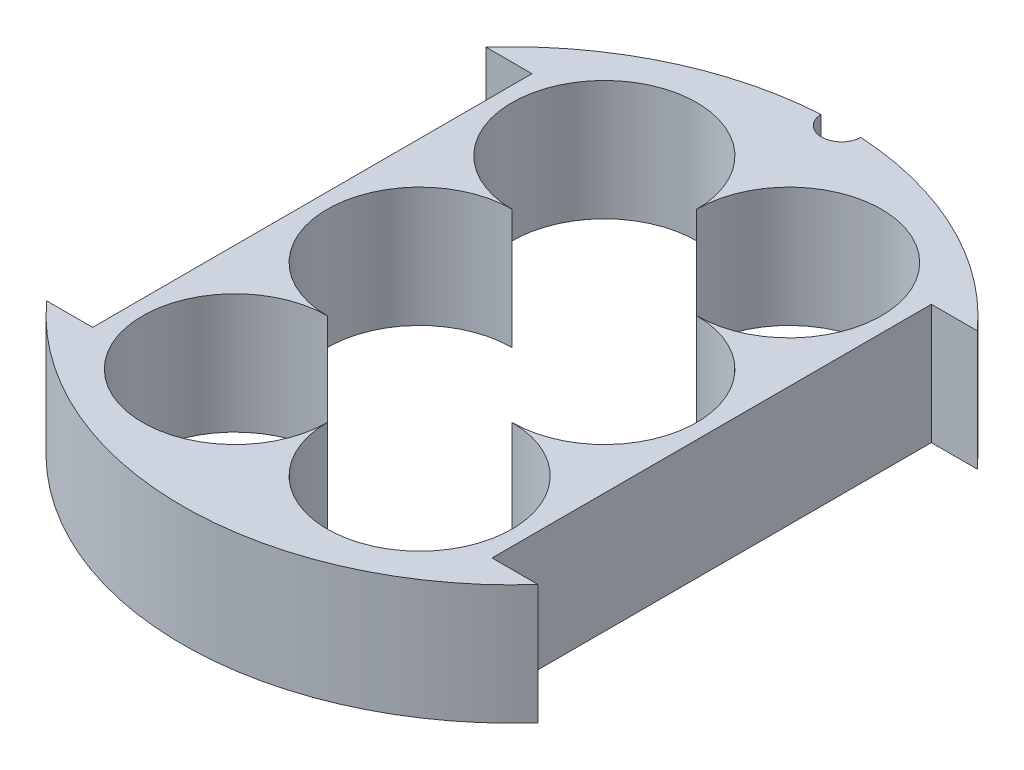
ISO-10303-21;
HEADER;
FILE_DESCRIPTION(('STEP AP214'),'2;1');
FILE_NAME('part.step','',(''),(''),'','','');
FILE_SCHEMA(('AUTOMOTIVE_DESIGN { 1 0 10303 214 1 1 1 1 }'));
ENDSEC;
DATA;
#1=APPLICATION_CONTEXT('core data for automotive mechanical design processes');
#2=APPLICATION_PROTOCOL_DEFINITION('international standard','automotive_design',2000,#1);
#3=PRODUCT_CONTEXT('',#1,'mechanical');
#4=PRODUCT('Part','Part','',(#3));
#5=PRODUCT_RELATED_PRODUCT_CATEGORY('part','',(#4));
#6=PRODUCT_DEFINITION_FORMATION('','',#4);
#7=PRODUCT_DEFINITION_CONTEXT('part definition',#1,'design');
#8=PRODUCT_DEFINITION('design','',#6,#7);
#9=PRODUCT_DEFINITION_SHAPE('','',#8);
#10=(LENGTH_UNIT() NAMED_UNIT(*) SI_UNIT(.MILLI.,.METRE.));
#11=(NAMED_UNIT(*) PLANE_ANGLE_UNIT() SI_UNIT($,.RADIAN.));
#12=(NAMED_UNIT(*) SI_UNIT($,.STERADIAN.) SOLID_ANGLE_UNIT());
#13=UNCERTAINTY_MEASURE_WITH_UNIT(LENGTH_MEASURE(1.E-05),#10,'distance_accuracy_value','');
#14=(GEOMETRIC_REPRESENTATION_CONTEXT(3) GLOBAL_UNCERTAINTY_ASSIGNED_CONTEXT((#13)) GLOBAL_UNIT_ASSIGNED_CONTEXT((#10,
#11,#12)) REPRESENTATION_CONTEXT('',''));
#15=CARTESIAN_POINT('',(0.,0.,0.));
#16=DIRECTION('',(0.,0.,1.));
#17=DIRECTION('',(1.,0.,0.));
#18=AXIS2_PLACEMENT_3D('',#15,#16,#17);
#19=CARTESIAN_POINT('',(9.25,12.,-18.5));
#20=DIRECTION('',(0.,-1.,0.));
#21=DIRECTION('',(0.,0.,-1.));
#22=AXIS2_PLACEMENT_3D('',#19,#20,#21);
#23=CYLINDRICAL_SURFACE('',#22,9.25);
#24=CARTESIAN_POINT('',(9.25,0.,-18.5));
#25=DIRECTION('',(0.,1.,0.));
#26=DIRECTION('',(0.,0.,1.));
#27=AXIS2_PLACEMENT_3D('',#24,#25,#26);
#28=CIRCLE('',#27,9.25);
#29=CARTESIAN_POINT('',(9.25,0.,-9.25));
#30=VERTEX_POINT('',#29);
#31=CARTESIAN_POINT('',(0.,0.,-18.5));
#32=VERTEX_POINT('',#31);
#33=EDGE_CURVE('E214',#30,#32,#28,.T.);
#34=ORIENTED_EDGE('',*,*,#33,.F.);
#35=DIRECTION('',(0.,-1.,0.));
#36=VECTOR('',#35,1.);
#37=CARTESIAN_POINT('',(9.25,12.,-9.25));
#38=LINE('',#37,#36);
#39=CARTESIAN_POINT('',(9.25,12.,-9.25));
#40=VERTEX_POINT('',#39);
#41=EDGE_CURVE('E11',#40,#30,#38,.T.);
#42=ORIENTED_EDGE('',*,*,#41,.F.);
#43=CARTESIAN_POINT('',(9.25,12.,-18.5));
#44=DIRECTION('',(0.,1.,0.));
#45=DIRECTION('',(0.,0.,1.));
#46=AXIS2_PLACEMENT_3D('',#43,#44,#45);
#47=CIRCLE('',#46,9.25);
#48=CARTESIAN_POINT('',(0.,12.,-18.5));
#49=VERTEX_POINT('',#48);
#50=EDGE_CURVE('E462',#40,#49,#47,.T.);
#51=ORIENTED_EDGE('',*,*,#50,.T.);
#52=DIRECTION('',(0.,-1.,0.));
#53=VECTOR('',#52,1.);
#54=CARTESIAN_POINT('',(0.,12.,-18.5));
#55=LINE('',#54,#53);
#56=EDGE_CURVE('E58',#49,#32,#55,.T.);
#57=ORIENTED_EDGE('',*,*,#56,.T.);
#58=EDGE_LOOP('',(#34,#42,#51,#57));
#59=FACE_BOUND('',#58,.T.);
#60=ADVANCED_FACE('F39',(#59),#23,.F.);
#61=CARTESIAN_POINT('',(9.25,12.,0.));
#62=DIRECTION('',(0.,-1.,0.));
#63=DIRECTION('',(0.,0.,-1.));
#64=AXIS2_PLACEMENT_3D('',#61,#62,#63);
#65=CYLINDRICAL_SURFACE('',#64,9.25);
#66=CARTESIAN_POINT('',(9.25,0.,0.));
#67=DIRECTION('',(0.,1.,0.));
#68=DIRECTION('',(0.,0.,1.));
#69=AXIS2_PLACEMENT_3D('',#66,#67,#68);
#70=CIRCLE('',#69,9.25);
#71=CARTESIAN_POINT('',(9.25,0.,9.25));
#72=VERTEX_POINT('',#71);
#73=EDGE_CURVE('E216',#72,#30,#70,.T.);
#74=ORIENTED_EDGE('',*,*,#73,.F.);
#75=DIRECTION('',(0.,-1.,0.));
#76=VECTOR('',#75,1.);
#77=CARTESIAN_POINT('',(9.25,12.,9.25));
#78=LINE('',#77,#76);
#79=CARTESIAN_POINT('',(9.25,12.,9.25));
#80=VERTEX_POINT('',#79);
#81=EDGE_CURVE('E49',#80,#72,#78,.T.);
#82=ORIENTED_EDGE('',*,*,#81,.F.);
#83=CARTESIAN_POINT('',(9.25,12.,0.));
#84=DIRECTION('',(0.,1.,0.));
#85=DIRECTION('',(0.,0.,1.));
#86=AXIS2_PLACEMENT_3D('',#83,#84,#85);
#87=CIRCLE('',#86,9.25);
#88=EDGE_CURVE('E464',#80,#40,#87,.T.);
#89=ORIENTED_EDGE('',*,*,#88,.T.);
#90=ORIENTED_EDGE('',*,*,#41,.T.);
#91=EDGE_LOOP('',(#74,#82,#89,#90));
#92=FACE_BOUND('',#91,.T.);
#93=ADVANCED_FACE('F314',(#92),#65,.F.);
#94=CARTESIAN_POINT('',(9.25,12.,18.5));
#95=DIRECTION('',(0.,-1.,0.));
#96=DIRECTION('',(0.,0.,-1.));
#97=AXIS2_PLACEMENT_3D('',#94,#95,#96);
#98=CYLINDRICAL_SURFACE('',#97,9.25);
#99=CARTESIAN_POINT('',(9.25,0.,18.5));
#100=DIRECTION('',(0.,1.,0.));
#101=DIRECTION('',(0.,0.,1.));
#102=AXIS2_PLACEMENT_3D('',#99,#100,#101);
#103=CIRCLE('',#102,9.25);
#104=CARTESIAN_POINT('',(0.,0.,18.5));
#105=VERTEX_POINT('',#104);
#106=EDGE_CURVE('E219',#105,#72,#103,.T.);
#107=ORIENTED_EDGE('',*,*,#106,.F.);
#108=DIRECTION('',(0.,-1.,0.));
#109=VECTOR('',#108,1.);
#110=CARTESIAN_POINT('',(0.,12.,18.5));
#111=LINE('',#110,#109);
#112=CARTESIAN_POINT('',(0.,12.,18.5));
#113=VERTEX_POINT('',#112);
#114=EDGE_CURVE('E169',#113,#105,#111,.T.);
#115=ORIENTED_EDGE('',*,*,#114,.F.);
#116=CARTESIAN_POINT('',(9.25,12.,18.5));
#117=DIRECTION('',(0.,1.,0.));
#118=DIRECTION('',(0.,0.,1.));
#119=AXIS2_PLACEMENT_3D('',#116,#117,#118);
#120=CIRCLE('',#119,9.25);
#121=EDGE_CURVE('E180',#113,#80,#120,.T.);
#122=ORIENTED_EDGE('',*,*,#121,.T.);
#123=ORIENTED_EDGE('',*,*,#81,.T.);
#124=EDGE_LOOP('',(#107,#115,#122,#123));
#125=FACE_BOUND('',#124,.T.);
#126=ADVANCED_FACE('F319',(#125),#98,.F.);
#127=CARTESIAN_POINT('',(-9.25,12.,18.5));
#128=DIRECTION('',(0.,-1.,0.));
#129=DIRECTION('',(0.,0.,-1.));
#130=AXIS2_PLACEMENT_3D('',#127,#128,#129);
#131=CYLINDRICAL_SURFACE('',#130,9.25);
#132=CARTESIAN_POINT('',(-9.25,0.,18.5));
#133=DIRECTION('',(0.,1.,0.));
#134=DIRECTION('',(0.,0.,1.));
#135=AXIS2_PLACEMENT_3D('',#132,#133,#134);
#136=CIRCLE('',#135,9.25);
#137=CARTESIAN_POINT('',(-9.25,0.,9.25));
#138=VERTEX_POINT('',#137);
#139=EDGE_CURVE('E165',#138,#105,#136,.T.);
#140=ORIENTED_EDGE('',*,*,#139,.F.);
#141=DIRECTION('',(0.,-1.,0.));
#142=VECTOR('',#141,1.);
#143=CARTESIAN_POINT('',(-9.25,12.,9.25));
#144=LINE('',#143,#142);
#145=CARTESIAN_POINT('',(-9.25,12.,9.25));
#146=VERTEX_POINT('',#145);
#147=EDGE_CURVE('E160',#146,#138,#144,.T.);
#148=ORIENTED_EDGE('',*,*,#147,.F.);
#149=CARTESIAN_POINT('',(-9.25,12.,18.5));
#150=DIRECTION('',(0.,1.,0.));
#151=DIRECTION('',(0.,0.,1.));
#152=AXIS2_PLACEMENT_3D('',#149,#150,#151);
#153=CIRCLE('',#152,9.25);
#154=EDGE_CURVE('E163',#146,#113,#153,.T.);
#155=ORIENTED_EDGE('',*,*,#154,.T.);
#156=ORIENTED_EDGE('',*,*,#114,.T.);
#157=EDGE_LOOP('',(#140,#148,#155,#156));
#158=FACE_BOUND('',#157,.T.);
#159=ADVANCED_FACE('F162',(#158),#131,.F.);
#160=CARTESIAN_POINT('',(-9.25,12.,0.));
#161=DIRECTION('',(0.,-1.,0.));
#162=DIRECTION('',(0.,0.,-1.));
#163=AXIS2_PLACEMENT_3D('',#160,#161,#162);
#164=CYLINDRICAL_SURFACE('',#163,9.25);
#165=CARTESIAN_POINT('',(-9.25,0.,0.));
#166=DIRECTION('',(0.,1.,0.));
#167=DIRECTION('',(0.,0.,1.));
#168=AXIS2_PLACEMENT_3D('',#165,#166,#167);
#169=CIRCLE('',#168,9.25);
#170=CARTESIAN_POINT('',(-9.25,0.,-9.25));
#171=VERTEX_POINT('',#170);
#172=EDGE_CURVE('E223',#171,#138,#169,.T.);
#173=ORIENTED_EDGE('',*,*,#172,.F.);
#174=DIRECTION('',(0.,-1.,0.));
#175=VECTOR('',#174,1.);
#176=CARTESIAN_POINT('',(-9.25,12.,-9.25));
#177=LINE('',#176,#175);
#178=CARTESIAN_POINT('',(-9.25,12.,-9.25));
#179=VERTEX_POINT('',#178);
#180=EDGE_CURVE('E107',#179,#171,#177,.T.);
#181=ORIENTED_EDGE('',*,*,#180,.F.);
#182=CARTESIAN_POINT('',(-9.25,12.,0.));
#183=DIRECTION('',(0.,1.,0.));
#184=DIRECTION('',(0.,0.,1.));
#185=AXIS2_PLACEMENT_3D('',#182,#183,#184);
#186=CIRCLE('',#185,9.25);
#187=EDGE_CURVE('E177',#179,#146,#186,.T.);
#188=ORIENTED_EDGE('',*,*,#187,.T.);
#189=ORIENTED_EDGE('',*,*,#147,.T.);
#190=EDGE_LOOP('',(#173,#181,#188,#189));
#191=FACE_BOUND('',#190,.T.);
#192=ADVANCED_FACE('F182',(#191),#164,.F.);
#193=CARTESIAN_POINT('',(20.,12.,0.));
#194=DIRECTION('',(-1.,0.,0.));
#195=DIRECTION('',(0.,0.,1.));
#196=AXIS2_PLACEMENT_3D('',#193,#194,#195);
#197=PLANE('',#196);
#198=DIRECTION('',(0.,0.,-1.));
#199=VECTOR('',#198,1.);
#200=CARTESIAN_POINT('',(20.,0.,0.));
#201=LINE('',#200,#199);
#202=CARTESIAN_POINT('',(20.,0.,22.));
#203=VERTEX_POINT('',#202);
#204=CARTESIAN_POINT('',(20.,0.,-22.));
#205=VERTEX_POINT('',#204);
#206=EDGE_CURVE('E189',#203,#205,#201,.T.);
#207=ORIENTED_EDGE('',*,*,#206,.T.);
#208=DIRECTION('',(0.,-1.,0.));
#209=VECTOR('',#208,1.);
#210=CARTESIAN_POINT('',(20.,12.,-22.));
#211=LINE('',#210,#209);
#212=CARTESIAN_POINT('',(20.,12.,-22.));
#213=VERTEX_POINT('',#212);
#214=EDGE_CURVE('E43',#213,#205,#211,.T.);
#215=ORIENTED_EDGE('',*,*,#214,.F.);
#216=DIRECTION('',(0.,0.,-1.));
#217=VECTOR('',#216,1.);
#218=CARTESIAN_POINT('',(20.,12.,0.));
#219=LINE('',#218,#217);
#220=CARTESIAN_POINT('',(20.,12.,22.));
#221=VERTEX_POINT('',#220);
#222=EDGE_CURVE('E228',#221,#213,#219,.T.);
#223=ORIENTED_EDGE('',*,*,#222,.F.);
#224=DIRECTION('',(0.,-1.,0.));
#225=VECTOR('',#224,1.);
#226=CARTESIAN_POINT('',(20.,12.,22.));
#227=LINE('',#226,#225);
#228=EDGE_CURVE('E185',#221,#203,#227,.T.);
#229=ORIENTED_EDGE('',*,*,#228,.T.);
#230=EDGE_LOOP('',(#207,#215,#223,#229));
#231=FACE_BOUND('',#230,.T.);
#232=ADVANCED_FACE('F41',(#231),#197,.F.);
#233=CARTESIAN_POINT('',(0.,12.,-22.));
#234=DIRECTION('',(0.,0.,-1.));
#235=DIRECTION('',(-1.,0.,0.));
#236=AXIS2_PLACEMENT_3D('',#233,#234,#235);
#237=PLANE('',#236);
#238=DIRECTION('',(1.,0.,0.));
#239=VECTOR('',#238,1.);
#240=CARTESIAN_POINT('',(0.,0.,-22.));
#241=LINE('',#240,#239);
#242=CARTESIAN_POINT('',(24.5967477524977,0.,-22.));
#243=VERTEX_POINT('',#242);
#244=EDGE_CURVE('E192',#205,#243,#241,.T.);
#245=ORIENTED_EDGE('',*,*,#244,.T.);
#246=DIRECTION('',(0.,-1.,0.));
#247=VECTOR('',#246,1.);
#248=CARTESIAN_POINT('',(24.5967477524977,12.,-22.));
#249=LINE('',#248,#247);
#250=CARTESIAN_POINT('',(24.5967477524977,12.,-22.));
#251=VERTEX_POINT('',#250);
#252=EDGE_CURVE('E251',#251,#243,#249,.T.);
#253=ORIENTED_EDGE('',*,*,#252,.F.);
#254=DIRECTION('',(1.,0.,0.));
#255=VECTOR('',#254,1.);
#256=CARTESIAN_POINT('',(0.,12.,-22.));
#257=LINE('',#256,#255);
#258=EDGE_CURVE('E120',#213,#251,#257,.T.);
#259=ORIENTED_EDGE('',*,*,#258,.F.);
#260=ORIENTED_EDGE('',*,*,#214,.T.);
#261=EDGE_LOOP('',(#245,#253,#259,#260));
#262=FACE_BOUND('',#261,.T.);
#263=ADVANCED_FACE('F257',(#262),#237,.F.);
#264=CARTESIAN_POINT('',(0.,12.,0.));
#265=DIRECTION('',(0.,-1.,0.));
#266=DIRECTION('',(0.,0.,-1.));
#267=AXIS2_PLACEMENT_3D('',#264,#265,#266);
#268=CYLINDRICAL_SURFACE('',#267,33.);
#269=CARTESIAN_POINT('',(0.,0.,0.));
#270=DIRECTION('',(0.,1.,0.));
#271=DIRECTION('',(0.,0.,1.));
#272=AXIS2_PLACEMENT_3D('',#269,#270,#271);
#273=CIRCLE('',#272,33.);
#274=CARTESIAN_POINT('',(1.99908151545108,0.,-32.9393939393939));
#275=VERTEX_POINT('',#274);
#276=EDGE_CURVE('E194',#243,#275,#273,.T.);
#277=ORIENTED_EDGE('',*,*,#276,.T.);
#278=DIRECTION('',(0.,-1.,0.));
#279=VECTOR('',#278,1.);
#280=CARTESIAN_POINT('',(1.99908151545108,12.,-32.9393939393939));
#281=LINE('',#280,#279);
#282=CARTESIAN_POINT('',(1.99908151545108,12.,-32.9393939393939));
#283=VERTEX_POINT('',#282);
#284=EDGE_CURVE('E250',#283,#275,#281,.T.);
#285=ORIENTED_EDGE('',*,*,#284,.F.);
#286=CARTESIAN_POINT('',(0.,12.,0.));
#287=DIRECTION('',(0.,1.,0.));
#288=DIRECTION('',(0.,0.,1.));
#289=AXIS2_PLACEMENT_3D('',#286,#287,#288);
#290=CIRCLE('',#289,33.);
#291=EDGE_CURVE('E477',#251,#283,#290,.T.);
#292=ORIENTED_EDGE('',*,*,#291,.F.);
#293=ORIENTED_EDGE('',*,*,#252,.T.);
#294=EDGE_LOOP('',(#277,#285,#292,#293));
#295=FACE_BOUND('',#294,.T.);
#296=ADVANCED_FACE('F304',(#295),#268,.T.);
#297=CARTESIAN_POINT('',(0.,12.,-33.));
#298=DIRECTION('',(0.,-1.,0.));
#299=DIRECTION('',(0.,0.,-1.));
#300=AXIS2_PLACEMENT_3D('',#297,#298,#299);
#301=CYLINDRICAL_SURFACE('',#300,2.00000000000008);
#302=CARTESIAN_POINT('',(0.,0.,-33.));
#303=DIRECTION('',(0.,1.,0.));
#304=DIRECTION('',(0.,0.,1.));
#305=AXIS2_PLACEMENT_3D('',#302,#303,#304);
#306=CIRCLE('',#305,2.00000000000008);
#307=CARTESIAN_POINT('',(-1.99908151545106,0.,-32.9393939393939));
#308=VERTEX_POINT('',#307);
#309=EDGE_CURVE('E197',#308,#275,#306,.T.);
#310=ORIENTED_EDGE('',*,*,#309,.F.);
#311=DIRECTION('',(0.,-1.,0.));
#312=VECTOR('',#311,1.);
#313=CARTESIAN_POINT('',(-1.99908151545106,12.,-32.9393939393939));
#314=LINE('',#313,#312);
#315=CARTESIAN_POINT('',(-1.99908151545106,12.,-32.9393939393939));
#316=VERTEX_POINT('',#315);
#317=EDGE_CURVE('E248',#316,#308,#314,.T.);
#318=ORIENTED_EDGE('',*,*,#317,.F.);
#319=CARTESIAN_POINT('',(0.,12.,-33.));
#320=DIRECTION('',(0.,1.,0.));
#321=DIRECTION('',(0.,0.,1.));
#322=AXIS2_PLACEMENT_3D('',#319,#320,#321);
#323=CIRCLE('',#322,2.00000000000008);
#324=EDGE_CURVE('E303',#316,#283,#323,.T.);
#325=ORIENTED_EDGE('',*,*,#324,.T.);
#326=ORIENTED_EDGE('',*,*,#284,.T.);
#327=EDGE_LOOP('',(#310,#318,#325,#326));
#328=FACE_BOUND('',#327,.T.);
#329=ADVANCED_FACE('F298',(#328),#301,.F.);
#330=CARTESIAN_POINT('',(0.,12.,0.));
#331=DIRECTION('',(0.,-1.,0.));
#332=DIRECTION('',(0.,0.,-1.));
#333=AXIS2_PLACEMENT_3D('',#330,#331,#332);
#334=CYLINDRICAL_SURFACE('',#333,33.);
#335=CARTESIAN_POINT('',(0.,0.,0.));
#336=DIRECTION('',(0.,1.,0.));
#337=DIRECTION('',(0.,0.,1.));
#338=AXIS2_PLACEMENT_3D('',#335,#336,#337);
#339=CIRCLE('',#338,33.);
#340=CARTESIAN_POINT('',(-24.5967477524977,0.,-22.));
#341=VERTEX_POINT('',#340);
#342=EDGE_CURVE('E200',#308,#341,#339,.T.);
#343=ORIENTED_EDGE('',*,*,#342,.T.);
#344=DIRECTION('',(0.,-1.,0.));
#345=VECTOR('',#344,1.);
#346=CARTESIAN_POINT('',(-24.5967477524977,12.,-22.));
#347=LINE('',#346,#345);
#348=CARTESIAN_POINT('',(-24.5967477524977,12.,-22.));
#349=VERTEX_POINT('',#348);
#350=EDGE_CURVE('E245',#349,#341,#347,.T.);
#351=ORIENTED_EDGE('',*,*,#350,.F.);
#352=CARTESIAN_POINT('',(0.,12.,0.));
#353=DIRECTION('',(0.,1.,0.));
#354=DIRECTION('',(0.,0.,1.));
#355=AXIS2_PLACEMENT_3D('',#352,#353,#354);
#356=CIRCLE('',#355,33.);
#357=EDGE_CURVE('E474',#316,#349,#356,.T.);
#358=ORIENTED_EDGE('',*,*,#357,.F.);
#359=ORIENTED_EDGE('',*,*,#317,.T.);
#360=EDGE_LOOP('',(#343,#351,#358,#359));
#361=FACE_BOUND('',#360,.T.);
#362=ADVANCED_FACE('F311',(#361),#334,.T.);
#363=CARTESIAN_POINT('',(0.,12.,-22.));
#364=DIRECTION('',(0.,0.,-1.));
#365=DIRECTION('',(-1.,0.,0.));
#366=AXIS2_PLACEMENT_3D('',#363,#364,#365);
#367=PLANE('',#366);
#368=DIRECTION('',(1.,0.,0.));
#369=VECTOR('',#368,1.);
#370=CARTESIAN_POINT('',(0.,0.,-22.));
#371=LINE('',#370,#369);
#372=CARTESIAN_POINT('',(-20.,0.,-22.));
#373=VERTEX_POINT('',#372);
#374=EDGE_CURVE('E202',#341,#373,#371,.T.);
#375=ORIENTED_EDGE('',*,*,#374,.T.);
#376=DIRECTION('',(0.,-1.,0.));
#377=VECTOR('',#376,1.);
#378=CARTESIAN_POINT('',(-20.,12.,-22.));
#379=LINE('',#378,#377);
#380=CARTESIAN_POINT('',(-20.,12.,-22.));
#381=VERTEX_POINT('',#380);
#382=EDGE_CURVE('E242',#381,#373,#379,.T.);
#383=ORIENTED_EDGE('',*,*,#382,.F.);
#384=DIRECTION('',(1.,0.,0.));
#385=VECTOR('',#384,1.);
#386=CARTESIAN_POINT('',(0.,12.,-22.));
#387=LINE('',#386,#385);
#388=EDGE_CURVE('E292',#349,#381,#387,.T.);
#389=ORIENTED_EDGE('',*,*,#388,.F.);
#390=ORIENTED_EDGE('',*,*,#350,.T.);
#391=EDGE_LOOP('',(#375,#383,#389,#390));
#392=FACE_BOUND('',#391,.T.);
#393=ADVANCED_FACE('F291',(#392),#367,.F.);
#394=CARTESIAN_POINT('',(-20.,12.,0.));
#395=DIRECTION('',(1.,0.,0.));
#396=DIRECTION('',(0.,0.,-1.));
#397=AXIS2_PLACEMENT_3D('',#394,#395,#396);
#398=PLANE('',#397);
#399=DIRECTION('',(0.,0.,1.));
#400=VECTOR('',#399,1.);
#401=CARTESIAN_POINT('',(-20.,0.,0.));
#402=LINE('',#401,#400);
#403=CARTESIAN_POINT('',(-20.,0.,22.));
#404=VERTEX_POINT('',#403);
#405=EDGE_CURVE('E204',#373,#404,#402,.T.);
#406=ORIENTED_EDGE('',*,*,#405,.T.);
#407=DIRECTION('',(0.,-1.,0.));
#408=VECTOR('',#407,1.);
#409=CARTESIAN_POINT('',(-20.,12.,22.));
#410=LINE('',#409,#408);
#411=CARTESIAN_POINT('',(-20.,12.,22.));
#412=VERTEX_POINT('',#411);
#413=EDGE_CURVE('E239',#412,#404,#410,.T.);
#414=ORIENTED_EDGE('',*,*,#413,.F.);
#415=DIRECTION('',(0.,0.,1.));
#416=VECTOR('',#415,1.);
#417=CARTESIAN_POINT('',(-20.,12.,0.));
#418=LINE('',#417,#416);
#419=EDGE_CURVE('E287',#381,#412,#418,.T.);
#420=ORIENTED_EDGE('',*,*,#419,.F.);
#421=ORIENTED_EDGE('',*,*,#382,.T.);
#422=EDGE_LOOP('',(#406,#414,#420,#421));
#423=FACE_BOUND('',#422,.T.);
#424=ADVANCED_FACE('F286',(#423),#398,.F.);
#425=CARTESIAN_POINT('',(0.,12.,22.));
#426=DIRECTION('',(0.,0.,1.));
#427=DIRECTION('',(1.,0.,0.));
#428=AXIS2_PLACEMENT_3D('',#425,#426,#427);
#429=PLANE('',#428);
#430=DIRECTION('',(-1.,0.,0.));
#431=VECTOR('',#430,1.);
#432=CARTESIAN_POINT('',(0.,0.,22.));
#433=LINE('',#432,#431);
#434=CARTESIAN_POINT('',(-24.5967477524977,0.,22.));
#435=VERTEX_POINT('',#434);
#436=EDGE_CURVE('E206',#404,#435,#433,.T.);
#437=ORIENTED_EDGE('',*,*,#436,.T.);
#438=DIRECTION('',(0.,-1.,0.));
#439=VECTOR('',#438,1.);
#440=CARTESIAN_POINT('',(-24.5967477524977,12.,22.));
#441=LINE('',#440,#439);
#442=CARTESIAN_POINT('',(-24.5967477524977,12.,22.));
#443=VERTEX_POINT('',#442);
#444=EDGE_CURVE('E236',#443,#435,#441,.T.);
#445=ORIENTED_EDGE('',*,*,#444,.F.);
#446=DIRECTION('',(-1.,0.,0.));
#447=VECTOR('',#446,1.);
#448=CARTESIAN_POINT('',(0.,12.,22.));
#449=LINE('',#448,#447);
#450=EDGE_CURVE('E283',#412,#443,#449,.T.);
#451=ORIENTED_EDGE('',*,*,#450,.F.);
#452=ORIENTED_EDGE('',*,*,#413,.T.);
#453=EDGE_LOOP('',(#437,#445,#451,#452));
#454=FACE_BOUND('',#453,.T.);
#455=ADVANCED_FACE('F280',(#454),#429,.F.);
#456=CARTESIAN_POINT('',(0.,12.,0.));
#457=DIRECTION('',(0.,-1.,0.));
#458=DIRECTION('',(0.,0.,-1.));
#459=AXIS2_PLACEMENT_3D('',#456,#457,#458);
#460=CYLINDRICAL_SURFACE('',#459,33.);
#461=CARTESIAN_POINT('',(0.,0.,0.));
#462=DIRECTION('',(0.,1.,0.));
#463=DIRECTION('',(0.,0.,1.));
#464=AXIS2_PLACEMENT_3D('',#461,#462,#463);
#465=CIRCLE('',#464,33.);
#466=CARTESIAN_POINT('',(24.5967477524977,0.,22.));
#467=VERTEX_POINT('',#466);
#468=EDGE_CURVE('E208',#435,#467,#465,.T.);
#469=ORIENTED_EDGE('',*,*,#468,.T.);
#470=DIRECTION('',(0.,-1.,0.));
#471=VECTOR('',#470,1.);
#472=CARTESIAN_POINT('',(24.5967477524977,12.,22.));
#473=LINE('',#472,#471);
#474=CARTESIAN_POINT('',(24.5967477524977,12.,22.));
#475=VERTEX_POINT('',#474);
#476=EDGE_CURVE('E234',#475,#467,#473,.T.);
#477=ORIENTED_EDGE('',*,*,#476,.F.);
#478=CARTESIAN_POINT('',(0.,12.,0.));
#479=DIRECTION('',(0.,1.,0.));
#480=DIRECTION('',(0.,0.,1.));
#481=AXIS2_PLACEMENT_3D('',#478,#479,#480);
#482=CIRCLE('',#481,33.);
#483=EDGE_CURVE('E469',#443,#475,#482,.T.);
#484=ORIENTED_EDGE('',*,*,#483,.F.);
#485=ORIENTED_EDGE('',*,*,#444,.T.);
#486=EDGE_LOOP('',(#469,#477,#484,#485));
#487=FACE_BOUND('',#486,.T.);
#488=ADVANCED_FACE('F274',(#487),#460,.T.);
#489=CARTESIAN_POINT('',(0.,12.,22.));
#490=DIRECTION('',(0.,0.,-1.));
#491=DIRECTION('',(-1.,0.,0.));
#492=AXIS2_PLACEMENT_3D('',#489,#490,#491);
#493=PLANE('',#492);
#494=DIRECTION('',(1.,0.,0.));
#495=VECTOR('',#494,1.);
#496=CARTESIAN_POINT('',(0.,0.,22.));
#497=LINE('',#496,#495);
#498=EDGE_CURVE('E211',#203,#467,#497,.T.);
#499=ORIENTED_EDGE('',*,*,#498,.F.);
#500=ORIENTED_EDGE('',*,*,#228,.F.);
#501=DIRECTION('',(1.,0.,0.));
#502=VECTOR('',#501,1.);
#503=CARTESIAN_POINT('',(0.,12.,22.));
#504=LINE('',#503,#502);
#505=EDGE_CURVE('E271',#221,#475,#504,.T.);
#506=ORIENTED_EDGE('',*,*,#505,.T.);
#507=ORIENTED_EDGE('',*,*,#476,.T.);
#508=EDGE_LOOP('',(#499,#500,#506,#507));
#509=FACE_BOUND('',#508,.T.);
#510=ADVANCED_FACE('F267',(#509),#493,.T.);
#511=CARTESIAN_POINT('',(-9.25,12.,-18.5));
#512=DIRECTION('',(0.,-1.,0.));
#513=DIRECTION('',(0.,0.,-1.));
#514=AXIS2_PLACEMENT_3D('',#511,#512,#513);
#515=CYLINDRICAL_SURFACE('',#514,9.25);
#516=CARTESIAN_POINT('',(-9.25,0.,-18.5));
#517=DIRECTION('',(0.,1.,0.));
#518=DIRECTION('',(0.,0.,1.));
#519=AXIS2_PLACEMENT_3D('',#516,#517,#518);
#520=CIRCLE('',#519,9.25);
#521=EDGE_CURVE('E225',#32,#171,#520,.T.);
#522=ORIENTED_EDGE('',*,*,#521,.F.);
#523=ORIENTED_EDGE('',*,*,#56,.F.);
#524=CARTESIAN_POINT('',(-9.25,12.,-18.5));
#525=DIRECTION('',(0.,1.,0.));
#526=DIRECTION('',(0.,0.,1.));
#527=AXIS2_PLACEMENT_3D('',#524,#525,#526);
#528=CIRCLE('',#527,9.25);
#529=EDGE_CURVE('E183',#49,#179,#528,.T.);
#530=ORIENTED_EDGE('',*,*,#529,.T.);
#531=ORIENTED_EDGE('',*,*,#180,.T.);
#532=EDGE_LOOP('',(#522,#523,#530,#531));
#533=FACE_BOUND('',#532,.T.);
#534=ADVANCED_FACE('F326',(#533),#515,.F.);
#535=CARTESIAN_POINT('',(0.,12.,0.));
#536=DIRECTION('',(0.,1.,0.));
#537=DIRECTION('',(0.,0.,1.));
#538=AXIS2_PLACEMENT_3D('',#535,#536,#537);
#539=PLANE('',#538);
#540=ORIENTED_EDGE('',*,*,#222,.T.);
#541=ORIENTED_EDGE('',*,*,#258,.T.);
#542=ORIENTED_EDGE('',*,*,#291,.T.);
#543=ORIENTED_EDGE('',*,*,#324,.F.);
#544=ORIENTED_EDGE('',*,*,#357,.T.);
#545=ORIENTED_EDGE('',*,*,#388,.T.);
#546=ORIENTED_EDGE('',*,*,#419,.T.);
#547=ORIENTED_EDGE('',*,*,#450,.T.);
#548=ORIENTED_EDGE('',*,*,#483,.T.);
#549=ORIENTED_EDGE('',*,*,#505,.F.);
#550=EDGE_LOOP('',(#540,#541,#542,#543,#544,#545,#546,#547,#548,#549));
#551=FACE_BOUND('',#550,.T.);
#552=ORIENTED_EDGE('',*,*,#50,.F.);
#553=ORIENTED_EDGE('',*,*,#88,.F.);
#554=ORIENTED_EDGE('',*,*,#121,.F.);
#555=ORIENTED_EDGE('',*,*,#154,.F.);
#556=ORIENTED_EDGE('',*,*,#187,.F.);
#557=ORIENTED_EDGE('',*,*,#529,.F.);
#558=EDGE_LOOP('',(#552,#553,#554,#555,#556,#557));
#559=FACE_BOUND('',#558,.T.);
#560=ADVANCED_FACE('F175',(#551,#559),#539,.T.);
#561=CARTESIAN_POINT('',(0.,0.,0.));
#562=DIRECTION('',(0.,1.,0.));
#563=DIRECTION('',(0.,0.,1.));
#564=AXIS2_PLACEMENT_3D('',#561,#562,#563);
#565=PLANE('',#564);
#566=ORIENTED_EDGE('',*,*,#206,.F.);
#567=ORIENTED_EDGE('',*,*,#498,.T.);
#568=ORIENTED_EDGE('',*,*,#468,.F.);
#569=ORIENTED_EDGE('',*,*,#436,.F.);
#570=ORIENTED_EDGE('',*,*,#405,.F.);
#571=ORIENTED_EDGE('',*,*,#374,.F.);
#572=ORIENTED_EDGE('',*,*,#342,.F.);
#573=ORIENTED_EDGE('',*,*,#309,.T.);
#574=ORIENTED_EDGE('',*,*,#276,.F.);
#575=ORIENTED_EDGE('',*,*,#244,.F.);
#576=EDGE_LOOP('',(#566,#567,#568,#569,#570,#571,#572,#573,#574,#575));
#577=FACE_BOUND('',#576,.T.);
#578=ORIENTED_EDGE('',*,*,#33,.T.);
#579=ORIENTED_EDGE('',*,*,#521,.T.);
#580=ORIENTED_EDGE('',*,*,#172,.T.);
#581=ORIENTED_EDGE('',*,*,#139,.T.);
#582=ORIENTED_EDGE('',*,*,#106,.T.);
#583=ORIENTED_EDGE('',*,*,#73,.T.);
#584=EDGE_LOOP('',(#578,#579,#580,#581,#582,#583));
#585=FACE_BOUND('',#584,.T.);
#586=ADVANCED_FACE('F263',(#577,#585),#565,.F.);
#587=CLOSED_SHELL('',(#60,#93,#126,#159,#192,#232,#263,#296,#329,#362,#393,#424,#455,#488,#510,
#534,#560,#586));
#588=MANIFOLD_SOLID_BREP('B2',#587);
#589=ADVANCED_BREP_SHAPE_REPRESENTATION('',(#18,#588),#14);
#590=SHAPE_DEFINITION_REPRESENTATION(#9,#589);
ENDSEC;
END-ISO-10303-21;
